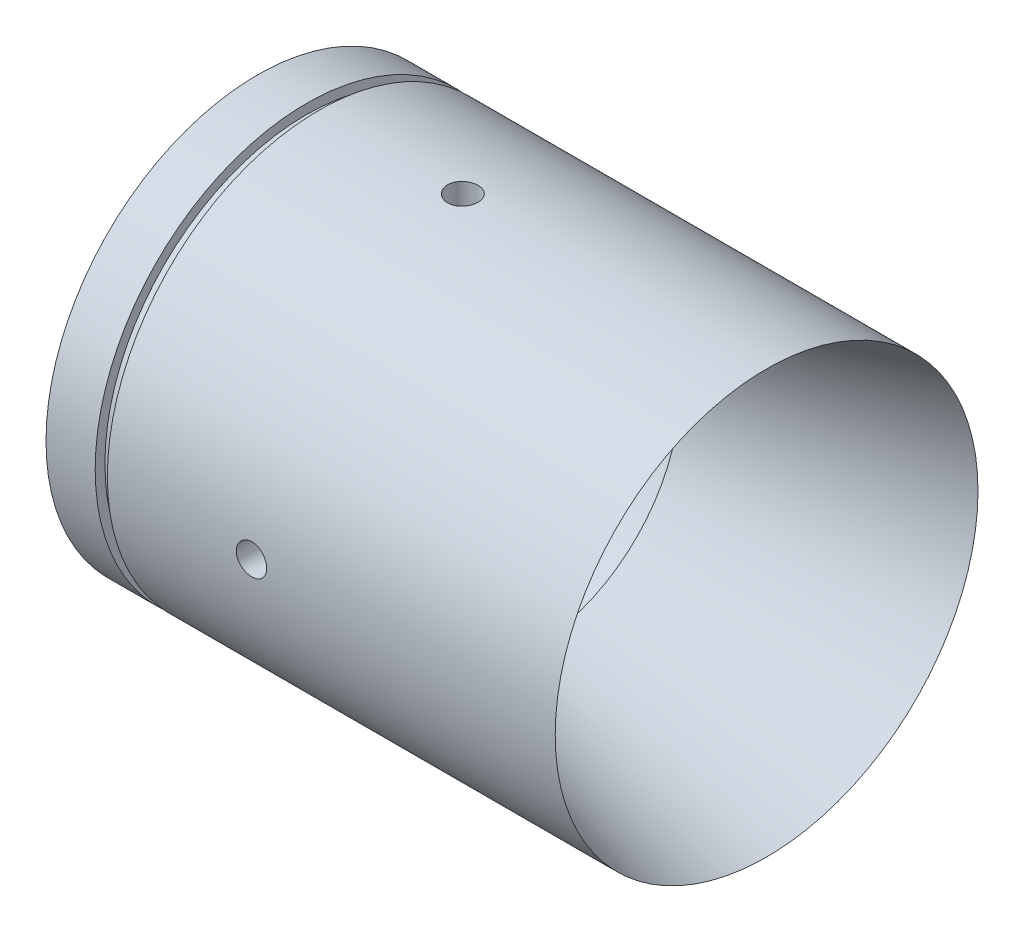
ISO-10303-21;
HEADER;
FILE_DESCRIPTION(('STEP AP214'),'2;1');
FILE_NAME('part.step','',(''),(''),'','','');
FILE_SCHEMA(('AUTOMOTIVE_DESIGN { 1 0 10303 214 1 1 1 1 }'));
ENDSEC;
DATA;
#1=APPLICATION_CONTEXT('core data for automotive mechanical design processes');
#2=APPLICATION_PROTOCOL_DEFINITION('international standard','automotive_design',2000,#1);
#3=PRODUCT_CONTEXT('',#1,'mechanical');
#4=PRODUCT('Part','Part','',(#3));
#5=PRODUCT_RELATED_PRODUCT_CATEGORY('part','',(#4));
#6=PRODUCT_DEFINITION_FORMATION('','',#4);
#7=PRODUCT_DEFINITION_CONTEXT('part definition',#1,'design');
#8=PRODUCT_DEFINITION('design','',#6,#7);
#9=PRODUCT_DEFINITION_SHAPE('','',#8);
#10=(LENGTH_UNIT() NAMED_UNIT(*) SI_UNIT(.MILLI.,.METRE.));
#11=(NAMED_UNIT(*) PLANE_ANGLE_UNIT() SI_UNIT($,.RADIAN.));
#12=(NAMED_UNIT(*) SI_UNIT($,.STERADIAN.) SOLID_ANGLE_UNIT());
#13=UNCERTAINTY_MEASURE_WITH_UNIT(LENGTH_MEASURE(1.E-05),#10,'distance_accuracy_value','');
#14=(GEOMETRIC_REPRESENTATION_CONTEXT(3) GLOBAL_UNCERTAINTY_ASSIGNED_CONTEXT((#13)) GLOBAL_UNIT_ASSIGNED_CONTEXT((#10,
#11,#12)) REPRESENTATION_CONTEXT('',''));
#15=CARTESIAN_POINT('',(0.,0.,0.));
#16=DIRECTION('',(0.,0.,1.));
#17=DIRECTION('',(1.,0.,0.));
#18=AXIS2_PLACEMENT_3D('',#15,#16,#17);
#19=CARTESIAN_POINT('',(56.7357994700031,0.,0.));
#20=DIRECTION('',(1.,0.,0.));
#21=DIRECTION('',(0.,0.,-1.));
#22=AXIS2_PLACEMENT_3D('',#19,#20,#21);
#23=CONICAL_SURFACE('',#22,24.42663247495,0.26179938779915);
#24=CARTESIAN_POINT('',(95.4422700174594,0.,0.));
#25=DIRECTION('',(-1.,0.,0.));
#26=DIRECTION('',(0.,0.,1.));
#27=AXIS2_PLACEMENT_3D('',#24,#25,#26);
#28=CIRCLE('',#27,34.798);
#29=CARTESIAN_POINT('',(95.4422700174594,0.,34.798));
#30=VERTEX_POINT('',#29);
#31=EDGE_CURVE('E112',#30,#30,#28,.T.);
#32=ORIENTED_EDGE('',*,*,#31,.F.);
#33=EDGE_LOOP('',(#32));
#34=FACE_BOUND('',#33,.T.);
#35=CARTESIAN_POINT('',(56.7357994700031,0.,0.));
#36=DIRECTION('',(-1.,0.,0.));
#37=DIRECTION('',(0.,0.,1.));
#38=AXIS2_PLACEMENT_3D('',#35,#36,#37);
#39=CIRCLE('',#38,24.42663247495);
#40=CARTESIAN_POINT('',(56.7357994700031,0.,24.42663247495));
#41=VERTEX_POINT('',#40);
#42=EDGE_CURVE('E148',#41,#41,#39,.T.);
#43=ORIENTED_EDGE('',*,*,#42,.T.);
#44=EDGE_LOOP('',(#43));
#45=FACE_BOUND('',#44,.T.);
#46=ADVANCED_FACE('F45',(#34,#45),#23,.F.);
#47=CARTESIAN_POINT('',(0.,0.,0.));
#48=DIRECTION('',(-1.,0.,0.));
#49=DIRECTION('',(0.,0.,1.));
#50=AXIS2_PLACEMENT_3D('',#47,#48,#49);
#51=CYLINDRICAL_SURFACE('',#50,34.798);
#52=CARTESIAN_POINT('',(47.9422700174594,0.,34.798));
#53=CARTESIAN_POINT('',(47.9422638651147,-0.140232070224378,34.7979988131856));
#54=CARTESIAN_POINT('',(47.9304313322201,-0.280561204962303,34.797143266945));
#55=CARTESIAN_POINT('',(47.8834006635371,-0.55734143785648,34.7938125771131));
#56=CARTESIAN_POINT('',(47.8481756312223,-0.693787883173452,34.7913355692237));
#57=CARTESIAN_POINT('',(47.7553797950332,-0.958753720267815,34.7850420473997));
#58=CARTESIAN_POINT('',(47.6978211334051,-1.08727737554598,34.7812262614336));
#59=CARTESIAN_POINT('',(47.5620124693311,-1.3328065475426,34.7726838356696));
#60=CARTESIAN_POINT('',(47.4837670760282,-1.44981462205071,34.7679573988343));
#61=CARTESIAN_POINT('',(47.308641621064,-1.66924975252944,34.758114355118));
#62=CARTESIAN_POINT('',(47.2117299392095,-1.77165154610397,34.7529970951985));
#63=CARTESIAN_POINT('',(47.0020889353283,-1.95875089976409,34.7429546834242));
#64=CARTESIAN_POINT('',(46.8893589389798,-2.04344770471708,34.7380295397706));
#65=CARTESIAN_POINT('',(46.6511331021634,-2.19281467646115,34.7289215743421));
#66=CARTESIAN_POINT('',(46.525623677119,-2.25746323034525,34.724739555748));
#67=CARTESIAN_POINT('',(46.2654967177605,-2.36476040455502,34.7175981403018));
#68=CARTESIAN_POINT('',(46.1308793073209,-2.40740932402193,34.7146387268253));
#69=CARTESIAN_POINT('',(45.8566062215182,-2.4694248230028,34.7102826247283));
#70=CARTESIAN_POINT('',(45.7169597278509,-2.48883181636928,34.7088832237987));
#71=CARTESIAN_POINT('',(45.4363848217684,-2.50393736845123,34.7077968459207));
#72=CARTESIAN_POINT('',(45.2954564278373,-2.49963626848068,34.7081098443196));
#73=CARTESIAN_POINT('',(45.0165941839541,-2.46748119809726,34.7104104517583));
#74=CARTESIAN_POINT('',(44.8786552532201,-2.43967103645734,34.7123949459666));
#75=CARTESIAN_POINT('',(44.6094083529666,-2.36135526882414,34.7178100259643));
#76=CARTESIAN_POINT('',(44.4781004335723,-2.31084949129847,34.7212406226831));
#77=CARTESIAN_POINT('',(44.225702617916,-2.18852671286023,34.7291649178295));
#78=CARTESIAN_POINT('',(44.1046223415049,-2.11668992905148,34.7336596023302));
#79=CARTESIAN_POINT('',(43.8762220134568,-1.95375862095133,34.7432046376416));
#80=CARTESIAN_POINT('',(43.7689021678489,-1.86266380837176,34.7482549967702));
#81=CARTESIAN_POINT('',(43.5708142995803,-1.66355597700898,34.7583561274119));
#82=CARTESIAN_POINT('',(43.4800843630888,-1.55550506154043,34.7634068738893));
#83=CARTESIAN_POINT('',(43.3180458649676,-1.32568477781079,34.7729286717732));
#84=CARTESIAN_POINT('',(43.2467373123731,-1.20391540316754,34.7773997229099));
#85=CARTESIAN_POINT('',(43.1255686390427,-0.950090997871727,34.7852588837137));
#86=CARTESIAN_POINT('',(43.0757100618037,-0.818035227838129,34.7886469154443));
#87=CARTESIAN_POINT('',(42.9988825867704,-0.547397355857924,34.7939573032981));
#88=CARTESIAN_POINT('',(42.9719133359024,-0.408815354614907,34.7958796820294));
#89=CARTESIAN_POINT('',(42.9416774947304,-0.129389165588208,34.798039247795));
#90=CARTESIAN_POINT('',(42.9383582677413,0.0114492988830646,34.7982801771232));
#91=CARTESIAN_POINT('',(42.9553790153833,0.291680859111885,34.7970596676351));
#92=CARTESIAN_POINT('',(42.9757188266859,0.431073964840654,34.7955982405707));
#93=CARTESIAN_POINT('',(43.0394366769996,0.704308925519821,34.7911398758925));
#94=CARTESIAN_POINT('',(43.0827904635603,0.838156464689569,34.7881445548347));
#95=CARTESIAN_POINT('',(43.1912809221519,1.09667656032768,34.7809551746432));
#96=CARTESIAN_POINT('',(43.2564178520888,1.22134900814435,34.7767611013166));
#97=CARTESIAN_POINT('',(43.4067588848614,1.45822035412203,34.7676356834002));
#98=CARTESIAN_POINT('',(43.4919980254457,1.57039696387806,34.7627030570712));
#99=CARTESIAN_POINT('',(43.6800730146969,1.77886772599583,34.7526595763064));
#100=CARTESIAN_POINT('',(43.7829090910135,1.87516167285355,34.7475487195656));
#101=CARTESIAN_POINT('',(44.0034864581062,2.04931291745418,34.7377138567571));
#102=CARTESIAN_POINT('',(44.12125481241,2.12713598373645,34.7329905794096));
#103=CARTESIAN_POINT('',(44.3682182573191,2.26190197830735,34.724475266893));
#104=CARTESIAN_POINT('',(44.49741325923,2.31884506865003,34.7206832244965));
#105=CARTESIAN_POINT('',(44.7634391779447,2.41017582399965,34.7144633323478));
#106=CARTESIAN_POINT('',(44.9002627506124,2.44458478955716,34.712034194612));
#107=CARTESIAN_POINT('',(45.1777633000552,2.48994002983755,34.7088105196398));
#108=CARTESIAN_POINT('',(45.3184402238526,2.50088662696858,34.708015959942));
#109=CARTESIAN_POINT('',(45.5993139145838,2.49900306410505,34.7081516026741));
#110=CARTESIAN_POINT('',(45.7395110473528,2.48622670469443,34.7090779024209));
#111=CARTESIAN_POINT('',(46.0157635038009,2.43737171538772,34.7125426103964));
#112=CARTESIAN_POINT('',(46.151818820409,2.40129304571167,34.7150810213772));
#113=CARTESIAN_POINT('',(46.4159315948728,2.30687037704918,34.7214829286438));
#114=CARTESIAN_POINT('',(46.5439892535566,2.24852693741249,34.7253463916406));
#115=CARTESIAN_POINT('',(46.7884996749989,2.11123753032451,34.7339630623031));
#116=CARTESIAN_POINT('',(46.9049526891096,2.03229200924097,34.7387162506913));
#117=CARTESIAN_POINT('',(47.1232224615629,1.85583843518412,34.7485894791245));
#118=CARTESIAN_POINT('',(47.2250073062475,1.75829094917522,34.7537102838096));
#119=CARTESIAN_POINT('',(47.4107954546222,1.54746584172785,34.7637349226143));
#120=CARTESIAN_POINT('',(47.4947944221383,1.43418439549179,34.7686387035938));
#121=CARTESIAN_POINT('',(47.6427088921662,1.19494158332964,34.777683360122));
#122=CARTESIAN_POINT('',(47.7065942518245,1.06896155639352,34.7818230868309));
#123=CARTESIAN_POINT('',(47.8122261743158,0.808122707008585,34.7888587470858));
#124=CARTESIAN_POINT('',(47.8539984675038,0.673274409919492,34.7917561254557));
#125=CARTESIAN_POINT('',(47.9034514885049,0.448010871321605,34.7952277277088));
#126=CARTESIAN_POINT('',(47.9179893979847,0.359048810136022,34.7962626633209));
#127=CARTESIAN_POINT('',(47.9374006288326,0.180071174693232,34.797649179902));
#128=CARTESIAN_POINT('',(47.9422739684323,0.0900556024237099,34.7980007621601));
#129=CARTESIAN_POINT('',(47.9422700174594,0.,34.798));
#130=B_SPLINE_CURVE_WITH_KNOTS('',3,(#52,#53,#54,#55,#56,#57,#58,#59,#60,#61,#62,#63,#64,#65,
#66,#67,#68,#69,#70,#71,#72,#73,#74,#75,#76,#77,#78,#79,#80,#81,#82,#83,#84,#85,#86,#87,#88,#89,
#90,#91,#92,#93,#94,#95,#96,#97,#98,#99,#100,#101,#102,#103,#104,#105,#106,#107,#108,#109,#110,
#111,#112,#113,#114,#115,#116,#117,#118,#119,#120,#121,#122,#123,#124,#125,#126,#127,#128,#129),
.UNSPECIFIED.,.T.,.F.,(4,2,2,2,2,2,2,2,2,2,2,2,2,2,2,2,2,2,2,2,2,2,2,2,2,2,2,2,2,2,2,2,2,2,2,2,
2,2,4),(0.,0.420367435957745,0.841219046130305,1.26184216948819,1.68237165404745,
2.10361987099586,2.5248860508695,2.94660480824208,3.36831783111974,3.7892964953813,
4.21026909903196,4.63045895166843,5.05065198013314,5.47123592953415,5.8918261754244,
6.31337018670221,6.73491439409325,7.15648892988496,7.57805696266357,7.99868643846272,
8.41931301049545,8.83949719773544,9.25968636000793,9.68061338811127,10.1015458621161,
10.5232524489597,10.9449557627771,11.366259880799,11.787558209433,12.2079022549593,
12.6282470180673,13.0485812217014,13.468906319068,13.8901325440612,14.3114613455217,
14.7334185900431,15.1548837676812,15.4248399484405,15.6947956199492),.UNSPECIFIED.);
#131=CARTESIAN_POINT('',(47.9422700174594,0.,34.798));
#132=VERTEX_POINT('',#131);
#133=EDGE_CURVE('E10',#132,#132,#130,.T.);
#134=ORIENTED_EDGE('',*,*,#133,.T.);
#135=EDGE_LOOP('',(#134));
#136=FACE_BOUND('',#135,.T.);
#137=CARTESIAN_POINT('',(45.4422700174594,-34.7080798085979,-2.5));
#138=CARTESIAN_POINT('',(45.3020384738666,-34.7080810068695,-2.49999384717913));
#139=CARTESIAN_POINT('',(45.1617098640146,-34.7089388213644,-2.48816140015104));
#140=CARTESIAN_POINT('',(44.8849307217404,-34.7122776153492,-2.44113110355941));
#141=CARTESIAN_POINT('',(44.7484848425689,-34.7147604633841,-2.40590635567266));
#142=CARTESIAN_POINT('',(44.4835202023432,-34.7210666569983,-2.31311135160497));
#143=CARTESIAN_POINT('',(44.3549971729933,-34.7248892732472,-2.25555325122319));
#144=CARTESIAN_POINT('',(44.1094690487968,-34.7334433677983,-2.11974590864952));
#145=CARTESIAN_POINT('',(43.992461396949,-34.7381746436399,-2.04150127421308));
#146=CARTESIAN_POINT('',(43.7730257852098,-34.7480233138569,-1.86637658414449));
#147=CARTESIAN_POINT('',(43.6706232225416,-34.7531413577172,-1.769464738943));
#148=CARTESIAN_POINT('',(43.4835223856656,-34.7631808881759,-1.55982308598758));
#149=CARTESIAN_POINT('',(43.3988248642333,-34.7681023664097,-1.44709260600404));
#150=CARTESIAN_POINT('',(43.2494571463885,-34.7772001205087,-1.20886634941284));
#151=CARTESIAN_POINT('',(43.1848084304245,-34.7813755950842,-1.08335707136271));
#152=CARTESIAN_POINT('',(43.0775109159544,-34.7885039512966,-0.823230431599246));
#153=CARTESIAN_POINT('',(43.034861820255,-34.7914568494492,-0.688613192953277));
#154=CARTESIAN_POINT('',(42.9728459483896,-34.7958028248979,-0.414340616959004));
#155=CARTESIAN_POINT('',(42.9534387445383,-34.7971986103947,-0.27469446431809));
#156=CARTESIAN_POINT('',(42.9383326533466,-34.7982822390335,0.00587977523790211));
#157=CARTESIAN_POINT('',(42.9426334269348,-34.7979701066022,0.146807843790242));
#158=CARTESIAN_POINT('',(42.9747879839886,-34.795675317403,0.425671536224185));
#159=CARTESIAN_POINT('',(43.0025982871295,-34.7936957445512,0.563612202532549));
#160=CARTESIAN_POINT('',(43.0809149406978,-34.7882924018429,0.832862500996205));
#161=CARTESIAN_POINT('',(43.1314214594879,-34.784868621273,0.964172083953449));
#162=CARTESIAN_POINT('',(43.2537457657139,-34.7769569133654,1.21657190292953));
#163=CARTESIAN_POINT('',(43.3255831619298,-34.772468007659,1.33765260374271));
#164=CARTESIAN_POINT('',(43.4885157733275,-34.7629309396088,1.56605352019722));
#165=CARTESIAN_POINT('',(43.5796112771531,-34.7578827688831,1.67337352955215));
#166=CARTESIAN_POINT('',(43.7787195946145,-34.7477815119466,1.87146060428717));
#167=CARTESIAN_POINT('',(43.8867701648871,-34.7427284403985,1.96218972343144));
#168=CARTESIAN_POINT('',(44.1165894682751,-34.7331984445777,2.12422673754438));
#169=CARTESIAN_POINT('',(44.2383582089443,-34.728721520622,2.19553462181889));
#170=CARTESIAN_POINT('',(44.4921824514794,-34.720849603384,2.31670281594293));
#171=CARTESIAN_POINT('',(44.6242387923407,-34.7174546984597,2.36656137434609));
#172=CARTESIAN_POINT('',(44.8948779037368,-34.7121326323322,2.44338863638893));
#173=CARTESIAN_POINT('',(45.0334605725946,-34.7102054482707,2.47035769651155));
#174=CARTESIAN_POINT('',(45.3128870578696,-34.7080404741524,2.50059281959915));
#175=CARTESIAN_POINT('',(45.453725131332,-34.7077989196548,2.5039116998));
#176=CARTESIAN_POINT('',(45.7339558259132,-34.7090226040375,2.48689039818125));
#177=CARTESIAN_POINT('',(45.8733484570027,-34.7104878311362,2.46655037967228));
#178=CARTESIAN_POINT('',(46.1465811292219,-34.714956535011,2.40283259847564));
#179=CARTESIAN_POINT('',(46.2804269030906,-34.7179583785361,2.35947929452338));
#180=CARTESIAN_POINT('',(46.5389436820262,-34.7251606850747,2.25099039326711));
#181=CARTESIAN_POINT('',(46.6636145772487,-34.7293611624356,2.18585453522725));
#182=CARTESIAN_POINT('',(46.9004848874321,-34.738496546132,2.03551506763203));
#183=CARTESIAN_POINT('',(47.0126618408795,-34.7434327390471,1.95027614773267));
#184=CARTESIAN_POINT('',(47.221133399436,-34.7534788933798,1.76220140359811));
#185=CARTESIAN_POINT('',(47.3174278005213,-34.7585888570285,1.65936535334868));
#186=CARTESIAN_POINT('',(47.4915799952406,-34.7684178604793,1.43878778343587));
#187=CARTESIAN_POINT('',(47.5694035532672,-34.7731361639813,1.32101919651177));
#188=CARTESIAN_POINT('',(47.7041704112661,-34.7816396234676,1.07405515822107));
#189=CARTESIAN_POINT('',(47.7611138733622,-34.7854247866972,0.944859795587455));
#190=CARTESIAN_POINT('',(47.8524448815617,-34.791632021419,0.678834130093486));
#191=CARTESIAN_POINT('',(47.8868538891453,-34.7940553895515,0.542011226779835));
#192=CARTESIAN_POINT('',(47.9322094403981,-34.7972711975045,0.264512086475311));
#193=CARTESIAN_POINT('',(47.9431563029204,-34.7980636594892,0.12383590187727));
#194=CARTESIAN_POINT('',(47.9412735009022,-34.7979284212134,-0.15703826951899));
#195=CARTESIAN_POINT('',(47.928497319425,-34.7970045902938,-0.29723661981915));
#196=CARTESIAN_POINT('',(47.8796422570514,-34.7935482775092,-0.57349155497165));
#197=CARTESIAN_POINT('',(47.8435633385462,-34.7910157930481,-0.709548133139154));
#198=CARTESIAN_POINT('',(47.7491397110088,-34.7846266040699,-0.973663388802924));
#199=CARTESIAN_POINT('',(47.6907955566989,-34.7807699325442,-1.10172226546369));
#200=CARTESIAN_POINT('',(47.5535043442819,-34.7721647438501,-1.34623482367745));
#201=CARTESIAN_POINT('',(47.4745577338731,-34.7674162460621,-1.46268875733379));
#202=CARTESIAN_POINT('',(47.2981029765924,-34.7575483238317,-1.68095844060699));
#203=CARTESIAN_POINT('',(47.2005556447649,-34.7524281307232,-1.78274247669278));
#204=CARTESIAN_POINT('',(46.9897311762941,-34.7424002943373,-1.9685290658162));
#205=CARTESIAN_POINT('',(46.8764502130776,-34.7374927031488,-2.05252728058367));
#206=CARTESIAN_POINT('',(46.63720777937,-34.7284376313186,-2.20044095751089));
#207=CARTESIAN_POINT('',(46.5112275615303,-34.7242913007214,-2.26432613707864));
#208=CARTESIAN_POINT('',(46.2503883042428,-34.7172425943412,-2.3699576696832));
#209=CARTESIAN_POINT('',(46.1155397912865,-34.7143387734064,-2.41172975574953));
#210=CARTESIAN_POINT('',(45.8902768087042,-34.7108590426828,-2.46118218196505));
#211=CARTESIAN_POINT('',(45.8013155614706,-34.7098215420987,-2.47571982398573));
#212=CARTESIAN_POINT('',(45.6223395574569,-34.7084315409512,-2.49513069943523));
#213=CARTESIAN_POINT('',(45.5323248026823,-34.7080790390842,-2.50000395125767));
#214=CARTESIAN_POINT('',(45.4422700174594,-34.7080798085979,-2.5));
#215=B_SPLINE_CURVE_WITH_KNOTS('',3,(#137,#138,#139,#140,#141,#142,#143,#144,#145,#146,#147,
#148,#149,#150,#151,#152,#153,#154,#155,#156,#157,#158,#159,#160,#161,#162,#163,#164,#165,#166,
#167,#168,#169,#170,#171,#172,#173,#174,#175,#176,#177,#178,#179,#180,#181,#182,#183,#184,#185,
#186,#187,#188,#189,#190,#191,#192,#193,#194,#195,#196,#197,#198,#199,#200,#201,#202,#203,#204,
#205,#206,#207,#208,#209,#210,#211,#212,#213,#214),.UNSPECIFIED.,.T.,.F.,(4,2,2,2,2,2,2,2,2,2,2,
2,2,2,2,2,2,2,2,2,2,2,2,2,2,2,2,2,2,2,2,2,2,2,2,2,2,2,4),(0.,0.420365854253131,
0.841215917418299,1.26183723709979,1.68236494565742,2.10361523201788,2.52488342527907,
2.94660142159572,3.3683137207683,3.78929140976414,4.21026307795359,4.63045786798768,
5.05065577511833,5.47124115868705,5.89183284651051,6.31337478605378,6.73491695771527,
7.15649354390535,7.57806356430642,7.99869180914788,8.41931715052987,8.83949633978927,
9.25968055874788,9.68060838701995,10.1015416220155,10.5232490658249,10.9449532352133,
11.3662551934788,11.7875514261679,12.207899009091,12.628247270421,13.0485850597598,
13.4689137157772,13.8901378345608,14.3114645791525,14.7334226812292,15.154888664772,
15.4248423984254,15.6947956182925),.UNSPECIFIED.);
#216=CARTESIAN_POINT('',(45.4422700174594,-34.7080798085979,-2.5));
#217=VERTEX_POINT('',#216);
#218=EDGE_CURVE('E56',#217,#217,#215,.T.);
#219=ORIENTED_EDGE('',*,*,#218,.T.);
#220=EDGE_LOOP('',(#219));
#221=FACE_BOUND('',#220,.T.);
#222=CARTESIAN_POINT('',(45.4422700174594,2.50000000000037,-34.7080798085979));
#223=CARTESIAN_POINT('',(45.3020384738666,2.49999384717949,-34.7080810068695));
#224=CARTESIAN_POINT('',(45.1617098640146,2.4881614001514,-34.7089388213644));
#225=CARTESIAN_POINT('',(44.8849307217404,2.44113110355978,-34.7122776153492));
#226=CARTESIAN_POINT('',(44.7484848425689,2.40590635567303,-34.7147604633841));
#227=CARTESIAN_POINT('',(44.4835202023432,2.31311135160533,-34.7210666569982));
#228=CARTESIAN_POINT('',(44.3549971729933,2.25555325122355,-34.7248892732472));
#229=CARTESIAN_POINT('',(44.1094690487968,2.11974590864988,-34.7334433677983));
#230=CARTESIAN_POINT('',(43.992461396949,2.04150127421345,-34.7381746436399));
#231=CARTESIAN_POINT('',(43.7730257852098,1.86637658414485,-34.7480233138569));
#232=CARTESIAN_POINT('',(43.6706232225416,1.76946473894336,-34.7531413577172));
#233=CARTESIAN_POINT('',(43.4835223856656,1.55982308598795,-34.7631808881759));
#234=CARTESIAN_POINT('',(43.3988248642333,1.44709260600441,-34.7681023664097));
#235=CARTESIAN_POINT('',(43.2494571463885,1.20886634941321,-34.7772001205087));
#236=CARTESIAN_POINT('',(43.1848084304245,1.08335707136308,-34.7813755950842));
#237=CARTESIAN_POINT('',(43.0775109159544,0.823230431599611,-34.7885039512966));
#238=CARTESIAN_POINT('',(43.034861820255,0.688613192953642,-34.7914568494492));
#239=CARTESIAN_POINT('',(42.9728459483896,0.414340616959368,-34.7958028248979));
#240=CARTESIAN_POINT('',(42.9534387445383,0.274694464318454,-34.7971986103947));
#241=CARTESIAN_POINT('',(42.9383326533466,-0.00587977523753685,-34.7982822390335));
#242=CARTESIAN_POINT('',(42.9426334269348,-0.146807843789876,-34.7979701066022));
#243=CARTESIAN_POINT('',(42.9747879839886,-0.425671536223818,-34.795675317403));
#244=CARTESIAN_POINT('',(43.0025982871295,-0.563612202532182,-34.7936957445513));
#245=CARTESIAN_POINT('',(43.0809149406978,-0.832862500995839,-34.7882924018429));
#246=CARTESIAN_POINT('',(43.1314214594879,-0.964172083953083,-34.784868621273));
#247=CARTESIAN_POINT('',(43.2537457657139,-1.21657190292917,-34.7769569133654));
#248=CARTESIAN_POINT('',(43.3255831619298,-1.33765260374234,-34.772468007659));
#249=CARTESIAN_POINT('',(43.4885157733275,-1.56605352019685,-34.7629309396088));
#250=CARTESIAN_POINT('',(43.5796112771531,-1.67337352955178,-34.7578827688832));
#251=CARTESIAN_POINT('',(43.7787195946145,-1.8714606042868,-34.7477815119466));
#252=CARTESIAN_POINT('',(43.8867701648871,-1.96218972343108,-34.7427284403986));
#253=CARTESIAN_POINT('',(44.1165894682751,-2.12422673754401,-34.7331984445777));
#254=CARTESIAN_POINT('',(44.2383582089443,-2.19553462181852,-34.7287215206221));
#255=CARTESIAN_POINT('',(44.4921824514794,-2.31670281594257,-34.720849603384));
#256=CARTESIAN_POINT('',(44.6242387923407,-2.36656137434572,-34.7174546984597));
#257=CARTESIAN_POINT('',(44.8948779037368,-2.44338863638856,-34.7121326323323));
#258=CARTESIAN_POINT('',(45.0334605725946,-2.47035769651118,-34.7102054482707));
#259=CARTESIAN_POINT('',(45.3128870578696,-2.50059281959878,-34.7080404741524));
#260=CARTESIAN_POINT('',(45.4537251313321,-2.50391169979963,-34.7077989196549));
#261=CARTESIAN_POINT('',(45.7339558259132,-2.48689039818089,-34.7090226040375));
#262=CARTESIAN_POINT('',(45.8733484570027,-2.46655037967191,-34.7104878311362));
#263=CARTESIAN_POINT('',(46.1465811292219,-2.40283259847527,-34.714956535011));
#264=CARTESIAN_POINT('',(46.2804269030906,-2.35947929452302,-34.7179583785362));
#265=CARTESIAN_POINT('',(46.5389436820262,-2.25099039326674,-34.7251606850747));
#266=CARTESIAN_POINT('',(46.6636145772487,-2.18585453522688,-34.7293611624356));
#267=CARTESIAN_POINT('',(46.9004848874321,-2.03551506763168,-34.738496546132));
#268=CARTESIAN_POINT('',(47.0126618408795,-1.95027614773232,-34.7434327390471));
#269=CARTESIAN_POINT('',(47.221133399436,-1.76220140359775,-34.7534788933798));
#270=CARTESIAN_POINT('',(47.3174278005213,-1.65936535334832,-34.7585888570285));
#271=CARTESIAN_POINT('',(47.4915799952406,-1.43878778343551,-34.7684178604794));
#272=CARTESIAN_POINT('',(47.5694035532672,-1.32101919651141,-34.7731361639813));
#273=CARTESIAN_POINT('',(47.7041704112661,-1.07405515822071,-34.7816396234676));
#274=CARTESIAN_POINT('',(47.7611138733622,-0.944859795587092,-34.7854247866972));
#275=CARTESIAN_POINT('',(47.8524448815617,-0.678834130093122,-34.791632021419));
#276=CARTESIAN_POINT('',(47.8868538891453,-0.54201122677947,-34.7940553895515));
#277=CARTESIAN_POINT('',(47.9322094403981,-0.264512086474946,-34.7972711975045));
#278=CARTESIAN_POINT('',(47.9431563029204,-0.123835901876906,-34.7980636594892));
#279=CARTESIAN_POINT('',(47.9412735009022,0.157038269519355,-34.7979284212134));
#280=CARTESIAN_POINT('',(47.928497319425,0.297236619819515,-34.7970045902938));
#281=CARTESIAN_POINT('',(47.8796422570514,0.573491554972016,-34.7935482775092));
#282=CARTESIAN_POINT('',(47.8435633385462,0.709548133139518,-34.7910157930481));
#283=CARTESIAN_POINT('',(47.7491397110088,0.973663388803291,-34.7846266040699));
#284=CARTESIAN_POINT('',(47.6907955566989,1.10172226546406,-34.7807699325442));
#285=CARTESIAN_POINT('',(47.5535043442819,1.34623482367782,-34.7721647438501));
#286=CARTESIAN_POINT('',(47.4745577338731,1.46268875733416,-34.7674162460621));
#287=CARTESIAN_POINT('',(47.2981029765924,1.68095844060736,-34.7575483238317));
#288=CARTESIAN_POINT('',(47.2005556447649,1.78274247669315,-34.7524281307232));
#289=CARTESIAN_POINT('',(46.9897311762941,1.96852906581656,-34.7424002943373));
#290=CARTESIAN_POINT('',(46.8764502130776,2.05252728058404,-34.7374927031488));
#291=CARTESIAN_POINT('',(46.63720777937,2.20044095751125,-34.7284376313186));
#292=CARTESIAN_POINT('',(46.5112275615303,2.264326137079,-34.7242913007214));
#293=CARTESIAN_POINT('',(46.2503883042428,2.36995766968357,-34.7172425943411));
#294=CARTESIAN_POINT('',(46.1155397912865,2.41172975574989,-34.7143387734063));
#295=CARTESIAN_POINT('',(45.8902768087042,2.46118218196541,-34.7108590426828));
#296=CARTESIAN_POINT('',(45.8013155614706,2.47571982398609,-34.7098215420986));
#297=CARTESIAN_POINT('',(45.6223395574569,2.4951306994356,-34.7084315409512));
#298=CARTESIAN_POINT('',(45.5323248026823,2.50000395125804,-34.7080790390842));
#299=CARTESIAN_POINT('',(45.4422700174594,2.50000000000037,-34.7080798085979));
#300=B_SPLINE_CURVE_WITH_KNOTS('',3,(#222,#223,#224,#225,#226,#227,#228,#229,#230,#231,#232,
#233,#234,#235,#236,#237,#238,#239,#240,#241,#242,#243,#244,#245,#246,#247,#248,#249,#250,#251,
#252,#253,#254,#255,#256,#257,#258,#259,#260,#261,#262,#263,#264,#265,#266,#267,#268,#269,#270,
#271,#272,#273,#274,#275,#276,#277,#278,#279,#280,#281,#282,#283,#284,#285,#286,#287,#288,#289,
#290,#291,#292,#293,#294,#295,#296,#297,#298,#299),.UNSPECIFIED.,.T.,.F.,(4,2,2,2,2,2,2,2,2,2,2,
2,2,2,2,2,2,2,2,2,2,2,2,2,2,2,2,2,2,2,2,2,2,2,2,2,2,2,4),(0.,0.420365854253131,
0.841215917418299,1.26183723709979,1.68236494565742,2.10361523201788,2.52488342527907,
2.94660142159572,3.3683137207683,3.78929140976414,4.21026307795359,4.63045786798767,
5.05065577511833,5.47124115868705,5.89183284651051,6.31337478605377,6.73491695771526,
7.15649354390535,7.57806356430643,7.99869180914789,8.41931715052987,8.83949633978926,
9.25968055874788,9.68060838701995,10.1015416220155,10.5232490658249,10.9449532352133,
11.3662551934788,11.7875514261679,12.207899009091,12.628247270421,13.0485850597598,
13.4689137157772,13.8901378345608,14.3114645791525,14.7334226812292,15.154888664772,
15.4248423984254,15.6947956182925),.UNSPECIFIED.);
#301=CARTESIAN_POINT('',(45.4422700174594,2.50000000000037,-34.7080798085979));
#302=VERTEX_POINT('',#301);
#303=EDGE_CURVE('E61',#302,#302,#300,.T.);
#304=ORIENTED_EDGE('',*,*,#303,.T.);
#305=EDGE_LOOP('',(#304));
#306=FACE_BOUND('',#305,.T.);
#307=CARTESIAN_POINT('',(45.4422700174594,34.7080798085979,2.5));
#308=CARTESIAN_POINT('',(45.3020384738666,34.7080810068695,2.49999384717913));
#309=CARTESIAN_POINT('',(45.1617098640146,34.7089388213644,2.48816140015104));
#310=CARTESIAN_POINT('',(44.8849307217404,34.7122776153492,2.44113110355941));
#311=CARTESIAN_POINT('',(44.7484848425689,34.7147604633841,2.40590635567266));
#312=CARTESIAN_POINT('',(44.4835202023432,34.7210666569983,2.31311135160497));
#313=CARTESIAN_POINT('',(44.3549971729933,34.7248892732472,2.25555325122319));
#314=CARTESIAN_POINT('',(44.1094690487968,34.7334433677983,2.11974590864952));
#315=CARTESIAN_POINT('',(43.992461396949,34.7381746436399,2.04150127421308));
#316=CARTESIAN_POINT('',(43.7730257852098,34.7480233138569,1.86637658414449));
#317=CARTESIAN_POINT('',(43.6706232225416,34.7531413577172,1.769464738943));
#318=CARTESIAN_POINT('',(43.4835223856656,34.7631808881759,1.55982308598758));
#319=CARTESIAN_POINT('',(43.3988248642333,34.7681023664097,1.44709260600404));
#320=CARTESIAN_POINT('',(43.2494571463885,34.7772001205088,1.20886634941284));
#321=CARTESIAN_POINT('',(43.1848084304245,34.7813755950842,1.08335707136271));
#322=CARTESIAN_POINT('',(43.0775109159544,34.7885039512966,0.823230431599246));
#323=CARTESIAN_POINT('',(43.034861820255,34.7914568494492,0.688613192953277));
#324=CARTESIAN_POINT('',(42.9728459483896,34.7958028248979,0.414340616959004));
#325=CARTESIAN_POINT('',(42.9534387445383,34.7971986103947,0.27469446431809));
#326=CARTESIAN_POINT('',(42.9383326533466,34.7982822390335,-0.00587977523790211));
#327=CARTESIAN_POINT('',(42.9426334269348,34.7979701066022,-0.146807843790242));
#328=CARTESIAN_POINT('',(42.9747879839886,34.795675317403,-0.425671536224185));
#329=CARTESIAN_POINT('',(43.0025982871295,34.7936957445513,-0.563612202532549));
#330=CARTESIAN_POINT('',(43.0809149406978,34.7882924018429,-0.832862500996205));
#331=CARTESIAN_POINT('',(43.1314214594879,34.784868621273,-0.964172083953449));
#332=CARTESIAN_POINT('',(43.2537457657139,34.7769569133654,-1.21657190292953));
#333=CARTESIAN_POINT('',(43.3255831619298,34.772468007659,-1.33765260374271));
#334=CARTESIAN_POINT('',(43.4885157733275,34.7629309396088,-1.56605352019722));
#335=CARTESIAN_POINT('',(43.5796112771531,34.7578827688832,-1.67337352955215));
#336=CARTESIAN_POINT('',(43.7787195946145,34.7477815119466,-1.87146060428717));
#337=CARTESIAN_POINT('',(43.8867701648871,34.7427284403986,-1.96218972343144));
#338=CARTESIAN_POINT('',(44.1165894682751,34.7331984445777,-2.12422673754438));
#339=CARTESIAN_POINT('',(44.2383582089443,34.7287215206221,-2.19553462181889));
#340=CARTESIAN_POINT('',(44.4921824514794,34.720849603384,-2.31670281594293));
#341=CARTESIAN_POINT('',(44.6242387923407,34.7174546984597,-2.36656137434609));
#342=CARTESIAN_POINT('',(44.8948779037368,34.7121326323322,-2.44338863638893));
#343=CARTESIAN_POINT('',(45.0334605725946,34.7102054482707,-2.47035769651155));
#344=CARTESIAN_POINT('',(45.3128870578696,34.7080404741524,-2.50059281959915));
#345=CARTESIAN_POINT('',(45.453725131332,34.7077989196549,-2.5039116998));
#346=CARTESIAN_POINT('',(45.7339558259132,34.7090226040375,-2.48689039818125));
#347=CARTESIAN_POINT('',(45.8733484570027,34.7104878311362,-2.46655037967228));
#348=CARTESIAN_POINT('',(46.1465811292219,34.714956535011,-2.40283259847564));
#349=CARTESIAN_POINT('',(46.2804269030906,34.7179583785361,-2.35947929452338));
#350=CARTESIAN_POINT('',(46.5389436820262,34.7251606850747,-2.25099039326711));
#351=CARTESIAN_POINT('',(46.6636145772487,34.7293611624356,-2.18585453522725));
#352=CARTESIAN_POINT('',(46.9004848874321,34.738496546132,-2.03551506763203));
#353=CARTESIAN_POINT('',(47.0126618408795,34.7434327390471,-1.95027614773267));
#354=CARTESIAN_POINT('',(47.221133399436,34.7534788933798,-1.76220140359811));
#355=CARTESIAN_POINT('',(47.3174278005213,34.7585888570285,-1.65936535334868));
#356=CARTESIAN_POINT('',(47.4915799952406,34.7684178604793,-1.43878778343587));
#357=CARTESIAN_POINT('',(47.5694035532672,34.7731361639813,-1.32101919651177));
#358=CARTESIAN_POINT('',(47.7041704112661,34.7816396234676,-1.07405515822107));
#359=CARTESIAN_POINT('',(47.7611138733622,34.7854247866972,-0.944859795587455));
#360=CARTESIAN_POINT('',(47.8524448815617,34.791632021419,-0.678834130093486));
#361=CARTESIAN_POINT('',(47.8868538891453,34.7940553895515,-0.542011226779835));
#362=CARTESIAN_POINT('',(47.9322094403981,34.7972711975045,-0.264512086475311));
#363=CARTESIAN_POINT('',(47.9431563029204,34.7980636594892,-0.12383590187727));
#364=CARTESIAN_POINT('',(47.9412735009022,34.7979284212134,0.15703826951899));
#365=CARTESIAN_POINT('',(47.928497319425,34.7970045902938,0.29723661981915));
#366=CARTESIAN_POINT('',(47.8796422570514,34.7935482775093,0.57349155497165));
#367=CARTESIAN_POINT('',(47.8435633385462,34.7910157930481,0.709548133139154));
#368=CARTESIAN_POINT('',(47.7491397110088,34.7846266040699,0.973663388802924));
#369=CARTESIAN_POINT('',(47.6907955566989,34.7807699325442,1.10172226546369));
#370=CARTESIAN_POINT('',(47.5535043442819,34.7721647438502,1.34623482367745));
#371=CARTESIAN_POINT('',(47.4745577338731,34.7674162460621,1.46268875733379));
#372=CARTESIAN_POINT('',(47.2981029765924,34.7575483238317,1.68095844060699));
#373=CARTESIAN_POINT('',(47.2005556447649,34.7524281307232,1.78274247669278));
#374=CARTESIAN_POINT('',(46.9897311762941,34.7424002943373,1.9685290658162));
#375=CARTESIAN_POINT('',(46.8764502130776,34.7374927031488,2.05252728058367));
#376=CARTESIAN_POINT('',(46.63720777937,34.7284376313186,2.20044095751089));
#377=CARTESIAN_POINT('',(46.5112275615303,34.7242913007215,2.26432613707864));
#378=CARTESIAN_POINT('',(46.2503883042428,34.7172425943412,2.3699576696832));
#379=CARTESIAN_POINT('',(46.1155397912865,34.7143387734064,2.41172975574953));
#380=CARTESIAN_POINT('',(45.8902768087042,34.7108590426828,2.46118218196505));
#381=CARTESIAN_POINT('',(45.8013155614706,34.7098215420987,2.47571982398573));
#382=CARTESIAN_POINT('',(45.6223395574569,34.7084315409512,2.49513069943523));
#383=CARTESIAN_POINT('',(45.5323248026823,34.7080790390842,2.50000395125767));
#384=CARTESIAN_POINT('',(45.4422700174594,34.7080798085979,2.5));
#385=B_SPLINE_CURVE_WITH_KNOTS('',3,(#307,#308,#309,#310,#311,#312,#313,#314,#315,#316,#317,
#318,#319,#320,#321,#322,#323,#324,#325,#326,#327,#328,#329,#330,#331,#332,#333,#334,#335,#336,
#337,#338,#339,#340,#341,#342,#343,#344,#345,#346,#347,#348,#349,#350,#351,#352,#353,#354,#355,
#356,#357,#358,#359,#360,#361,#362,#363,#364,#365,#366,#367,#368,#369,#370,#371,#372,#373,#374,
#375,#376,#377,#378,#379,#380,#381,#382,#383,#384),.UNSPECIFIED.,.T.,.F.,(4,2,2,2,2,2,2,2,2,2,2,
2,2,2,2,2,2,2,2,2,2,2,2,2,2,2,2,2,2,2,2,2,2,2,2,2,2,2,4),(0.,0.420365854253131,
0.841215917418299,1.26183723709979,1.68236494565742,2.10361523201788,2.52488342527907,
2.94660142159572,3.3683137207683,3.78929140976414,4.21026307795359,4.63045786798768,
5.05065577511833,5.47124115868705,5.89183284651051,6.31337478605378,6.73491695771527,
7.15649354390535,7.57806356430642,7.99869180914788,8.41931715052987,8.83949633978927,
9.25968055874788,9.68060838701995,10.1015416220155,10.5232490658249,10.9449532352133,
11.3662551934788,11.7875514261679,12.207899009091,12.628247270421,13.0485850597598,
13.4689137157772,13.8901378345608,14.3114645791525,14.7334226812292,15.154888664772,
15.4248423984254,15.6947956182925),.UNSPECIFIED.);
#386=CARTESIAN_POINT('',(45.4422700174594,34.7080798085979,2.5));
#387=VERTEX_POINT('',#386);
#388=EDGE_CURVE('E66',#387,#387,#385,.T.);
#389=ORIENTED_EDGE('',*,*,#388,.T.);
#390=EDGE_LOOP('',(#389));
#391=FACE_BOUND('',#390,.T.);
#392=CARTESIAN_POINT('',(21.7236854249492,0.,0.));
#393=DIRECTION('',(-1.,0.,0.));
#394=DIRECTION('',(0.,0.,1.));
#395=AXIS2_PLACEMENT_3D('',#392,#393,#394);
#396=CIRCLE('',#395,34.798);
#397=CARTESIAN_POINT('',(21.7236854249492,0.,34.798));
#398=VERTEX_POINT('',#397);
#399=EDGE_CURVE('E116',#398,#398,#396,.T.);
#400=ORIENTED_EDGE('',*,*,#399,.F.);
#401=EDGE_LOOP('',(#400));
#402=FACE_BOUND('',#401,.T.);
#403=ORIENTED_EDGE('',*,*,#31,.T.);
#404=EDGE_LOOP('',(#403));
#405=FACE_BOUND('',#404,.T.);
#406=ADVANCED_FACE('F77',(#136,#221,#306,#391,#402,#405),#51,.T.);
#407=CARTESIAN_POINT('',(21.7236854249492,33.198,0.));
#408=DIRECTION('',(1.,0.,0.));
#409=DIRECTION('',(0.,0.,-1.));
#410=AXIS2_PLACEMENT_3D('',#407,#408,#409);
#411=PLANE('',#410);
#412=CARTESIAN_POINT('',(21.7236854249492,0.,0.));
#413=DIRECTION('',(-1.,0.,0.));
#414=DIRECTION('',(0.,0.,1.));
#415=AXIS2_PLACEMENT_3D('',#412,#413,#414);
#416=CIRCLE('',#415,33.198);
#417=CARTESIAN_POINT('',(21.7236854249492,0.,33.198));
#418=VERTEX_POINT('',#417);
#419=EDGE_CURVE('E120',#418,#418,#416,.T.);
#420=ORIENTED_EDGE('',*,*,#419,.F.);
#421=EDGE_LOOP('',(#420));
#422=FACE_BOUND('',#421,.T.);
#423=ORIENTED_EDGE('',*,*,#399,.T.);
#424=EDGE_LOOP('',(#423));
#425=FACE_BOUND('',#424,.T.);
#426=ADVANCED_FACE('F187',(#422,#425),#411,.F.);
#427=CARTESIAN_POINT('',(0.,0.,0.));
#428=DIRECTION('',(-1.,0.,0.));
#429=DIRECTION('',(0.,0.,1.));
#430=AXIS2_PLACEMENT_3D('',#427,#428,#429);
#431=CYLINDRICAL_SURFACE('',#430,33.198);
#432=CARTESIAN_POINT('',(19.7236854249492,0.,0.));
#433=DIRECTION('',(-1.,0.,0.));
#434=DIRECTION('',(0.,0.,1.));
#435=AXIS2_PLACEMENT_3D('',#432,#433,#434);
#436=CIRCLE('',#435,33.198);
#437=CARTESIAN_POINT('',(19.7236854249492,0.,33.198));
#438=VERTEX_POINT('',#437);
#439=EDGE_CURVE('E124',#438,#438,#436,.T.);
#440=ORIENTED_EDGE('',*,*,#439,.F.);
#441=EDGE_LOOP('',(#440));
#442=FACE_BOUND('',#441,.T.);
#443=ORIENTED_EDGE('',*,*,#419,.T.);
#444=EDGE_LOOP('',(#443));
#445=FACE_BOUND('',#444,.T.);
#446=ADVANCED_FACE('F222',(#442,#445),#431,.T.);
#447=CARTESIAN_POINT('',(19.7236854249492,34.798,0.));
#448=DIRECTION('',(-1.,0.,0.));
#449=DIRECTION('',(0.,0.,1.));
#450=AXIS2_PLACEMENT_3D('',#447,#448,#449);
#451=PLANE('',#450);
#452=CARTESIAN_POINT('',(19.7236854249492,0.,0.));
#453=DIRECTION('',(-1.,0.,0.));
#454=DIRECTION('',(0.,0.,1.));
#455=AXIS2_PLACEMENT_3D('',#452,#453,#454);
#456=CIRCLE('',#455,34.798);
#457=CARTESIAN_POINT('',(19.7236854249492,0.,34.798));
#458=VERTEX_POINT('',#457);
#459=EDGE_CURVE('E128',#458,#458,#456,.T.);
#460=ORIENTED_EDGE('',*,*,#459,.F.);
#461=EDGE_LOOP('',(#460));
#462=FACE_BOUND('',#461,.T.);
#463=ORIENTED_EDGE('',*,*,#439,.T.);
#464=EDGE_LOOP('',(#463));
#465=FACE_BOUND('',#464,.T.);
#466=ADVANCED_FACE('F216',(#462,#465),#451,.F.);
#467=CARTESIAN_POINT('',(0.,0.,0.));
#468=DIRECTION('',(-1.,0.,0.));
#469=DIRECTION('',(0.,0.,1.));
#470=AXIS2_PLACEMENT_3D('',#467,#468,#469);
#471=CYLINDRICAL_SURFACE('',#470,34.798);
#472=CARTESIAN_POINT('',(11.6269295069273,0.,0.));
#473=DIRECTION('',(-1.,0.,0.));
#474=DIRECTION('',(0.,0.,1.));
#475=AXIS2_PLACEMENT_3D('',#472,#473,#474);
#476=CIRCLE('',#475,34.798);
#477=CARTESIAN_POINT('',(11.6269295069273,0.,34.798));
#478=VERTEX_POINT('',#477);
#479=EDGE_CURVE('E132',#478,#478,#476,.T.);
#480=ORIENTED_EDGE('',*,*,#479,.F.);
#481=EDGE_LOOP('',(#480));
#482=FACE_BOUND('',#481,.T.);
#483=ORIENTED_EDGE('',*,*,#459,.T.);
#484=EDGE_LOOP('',(#483));
#485=FACE_BOUND('',#484,.T.);
#486=ADVANCED_FACE('F210',(#482,#485),#471,.T.);
#487=CARTESIAN_POINT('',(11.6269295069273,34.798,0.));
#488=DIRECTION('',(1.,0.,0.));
#489=DIRECTION('',(0.,0.,-1.));
#490=AXIS2_PLACEMENT_3D('',#487,#488,#489);
#491=PLANE('',#490);
#492=CARTESIAN_POINT('',(11.6269295069273,0.,0.));
#493=DIRECTION('',(-1.,0.,0.));
#494=DIRECTION('',(0.,0.,1.));
#495=AXIS2_PLACEMENT_3D('',#492,#493,#494);
#496=CIRCLE('',#495,31.0014709454852);
#497=CARTESIAN_POINT('',(11.6269295069273,0.,31.0014709454852));
#498=VERTEX_POINT('',#497);
#499=EDGE_CURVE('E136',#498,#498,#496,.T.);
#500=ORIENTED_EDGE('',*,*,#499,.F.);
#501=EDGE_LOOP('',(#500));
#502=FACE_BOUND('',#501,.T.);
#503=ORIENTED_EDGE('',*,*,#479,.T.);
#504=EDGE_LOOP('',(#503));
#505=FACE_BOUND('',#504,.T.);
#506=ADVANCED_FACE('F204',(#502,#505),#491,.F.);
#507=CARTESIAN_POINT('',(11.6269295069273,0.,0.));
#508=DIRECTION('',(-1.,0.,0.));
#509=DIRECTION('',(0.,0.,1.));
#510=AXIS2_PLACEMENT_3D('',#507,#508,#509);
#511=CONICAL_SURFACE('',#510,31.0014709454852,0.223242956285071);
#512=CARTESIAN_POINT('',(29.4966103274177,0.,0.));
#513=DIRECTION('',(-1.,0.,0.));
#514=DIRECTION('',(0.,0.,1.));
#515=AXIS2_PLACEMENT_3D('',#512,#513,#514);
#516=CIRCLE('',#515,26.9445704348874);
#517=CARTESIAN_POINT('',(29.4966103274177,0.,26.9445704348874));
#518=VERTEX_POINT('',#517);
#519=EDGE_CURVE('E140',#518,#518,#516,.T.);
#520=ORIENTED_EDGE('',*,*,#519,.F.);
#521=EDGE_LOOP('',(#520));
#522=FACE_BOUND('',#521,.T.);
#523=ORIENTED_EDGE('',*,*,#499,.T.);
#524=EDGE_LOOP('',(#523));
#525=FACE_BOUND('',#524,.T.);
#526=ADVANCED_FACE('F199',(#522,#525),#511,.F.);
#527=CARTESIAN_POINT('',(0.,0.,0.));
#528=DIRECTION('',(-1.,0.,0.));
#529=DIRECTION('',(0.,0.,1.));
#530=AXIS2_PLACEMENT_3D('',#527,#528,#529);
#531=CYLINDRICAL_SURFACE('',#530,26.9445704348874);
#532=CARTESIAN_POINT('',(56.7357994700031,0.,0.));
#533=DIRECTION('',(-1.,0.,0.));
#534=DIRECTION('',(0.,0.,1.));
#535=AXIS2_PLACEMENT_3D('',#532,#533,#534);
#536=CIRCLE('',#535,26.9445704348874);
#537=CARTESIAN_POINT('',(56.7357994700031,0.,26.9445704348874));
#538=VERTEX_POINT('',#537);
#539=EDGE_CURVE('E144',#538,#538,#536,.T.);
#540=ORIENTED_EDGE('',*,*,#539,.F.);
#541=EDGE_LOOP('',(#540));
#542=FACE_BOUND('',#541,.T.);
#543=ORIENTED_EDGE('',*,*,#519,.T.);
#544=EDGE_LOOP('',(#543));
#545=FACE_BOUND('',#544,.T.);
#546=ADVANCED_FACE('F194',(#542,#545),#531,.F.);
#547=CARTESIAN_POINT('',(56.7357994700031,26.9445704348874,0.));
#548=DIRECTION('',(1.,0.,0.));
#549=DIRECTION('',(0.,0.,-1.));
#550=AXIS2_PLACEMENT_3D('',#547,#548,#549);
#551=PLANE('',#550);
#552=ORIENTED_EDGE('',*,*,#42,.F.);
#553=EDGE_LOOP('',(#552));
#554=FACE_BOUND('',#553,.T.);
#555=ORIENTED_EDGE('',*,*,#539,.T.);
#556=EDGE_LOOP('',(#555));
#557=FACE_BOUND('',#556,.T.);
#558=ADVANCED_FACE('F103',(#554,#557),#551,.F.);
#559=CARTESIAN_POINT('',(45.4422700174594,29.798,0.));
#560=DIRECTION('',(0.,1.,0.));
#561=DIRECTION('',(0.,0.,1.));
#562=AXIS2_PLACEMENT_3D('',#559,#560,#561);
#563=CYLINDRICAL_SURFACE('',#562,2.5);
#564=CARTESIAN_POINT('',(45.4422700174594,29.798,0.));
#565=DIRECTION('',(0.,1.,0.));
#566=DIRECTION('',(0.,0.,1.));
#567=AXIS2_PLACEMENT_3D('',#564,#565,#566);
#568=CIRCLE('',#567,2.5);
#569=CARTESIAN_POINT('',(45.4422700174594,29.798,2.5));
#570=VERTEX_POINT('',#569);
#571=EDGE_CURVE('E152',#570,#570,#568,.T.);
#572=ORIENTED_EDGE('',*,*,#571,.F.);
#573=EDGE_LOOP('',(#572));
#574=FACE_BOUND('',#573,.T.);
#575=ORIENTED_EDGE('',*,*,#388,.F.);
#576=EDGE_LOOP('',(#575));
#577=FACE_BOUND('',#576,.T.);
#578=ADVANCED_FACE('F98',(#574,#577),#563,.F.);
#579=CARTESIAN_POINT('',(45.4422700174594,29.798,0.));
#580=DIRECTION('',(0.,1.,0.));
#581=DIRECTION('',(0.,0.,1.));
#582=AXIS2_PLACEMENT_3D('',#579,#580,#581);
#583=PLANE('',#582);
#584=ORIENTED_EDGE('',*,*,#571,.T.);
#585=EDGE_LOOP('',(#584));
#586=FACE_BOUND('',#585,.T.);
#587=ADVANCED_FACE('F94',(#586),#583,.T.);
#588=CARTESIAN_POINT('',(45.4422700174594,3.12117482804543E-13,-29.798));
#589=DIRECTION('',(0.,0.,-1.));
#590=DIRECTION('',(0.,1.,0.));
#591=AXIS2_PLACEMENT_3D('',#588,#589,#590);
#592=CYLINDRICAL_SURFACE('',#591,2.5);
#593=CARTESIAN_POINT('',(45.4422700174594,3.12117482804543E-13,-29.798));
#594=DIRECTION('',(0.,0.,-1.));
#595=DIRECTION('',(0.,1.,0.));
#596=AXIS2_PLACEMENT_3D('',#593,#594,#595);
#597=CIRCLE('',#596,2.5);
#598=CARTESIAN_POINT('',(45.4422700174594,2.50000000000031,-29.798));
#599=VERTEX_POINT('',#598);
#600=EDGE_CURVE('E157',#599,#599,#597,.T.);
#601=ORIENTED_EDGE('',*,*,#600,.F.);
#602=EDGE_LOOP('',(#601));
#603=FACE_BOUND('',#602,.T.);
#604=ORIENTED_EDGE('',*,*,#303,.F.);
#605=EDGE_LOOP('',(#604));
#606=FACE_BOUND('',#605,.T.);
#607=ADVANCED_FACE('F89',(#603,#606),#592,.F.);
#608=CARTESIAN_POINT('',(45.4422700174594,3.12117482804543E-13,-29.798));
#609=DIRECTION('',(0.,0.,-1.));
#610=DIRECTION('',(0.,1.,0.));
#611=AXIS2_PLACEMENT_3D('',#608,#609,#610);
#612=PLANE('',#611);
#613=ORIENTED_EDGE('',*,*,#600,.T.);
#614=EDGE_LOOP('',(#613));
#615=FACE_BOUND('',#614,.T.);
#616=ADVANCED_FACE('F86',(#615),#612,.T.);
#617=CARTESIAN_POINT('',(45.4422700174594,-29.798,0.));
#618=DIRECTION('',(0.,-1.,0.));
#619=DIRECTION('',(0.,0.,-1.));
#620=AXIS2_PLACEMENT_3D('',#617,#618,#619);
#621=CYLINDRICAL_SURFACE('',#620,2.5);
#622=CARTESIAN_POINT('',(45.4422700174594,-29.798,0.));
#623=DIRECTION('',(0.,-1.,0.));
#624=DIRECTION('',(0.,0.,-1.));
#625=AXIS2_PLACEMENT_3D('',#622,#623,#624);
#626=CIRCLE('',#625,2.5);
#627=CARTESIAN_POINT('',(45.4422700174594,-29.798,-2.5));
#628=VERTEX_POINT('',#627);
#629=EDGE_CURVE('E161',#628,#628,#626,.T.);
#630=ORIENTED_EDGE('',*,*,#629,.F.);
#631=EDGE_LOOP('',(#630));
#632=FACE_BOUND('',#631,.T.);
#633=ORIENTED_EDGE('',*,*,#218,.F.);
#634=EDGE_LOOP('',(#633));
#635=FACE_BOUND('',#634,.T.);
#636=ADVANCED_FACE('F80',(#632,#635),#621,.F.);
#637=CARTESIAN_POINT('',(45.4422700174594,-29.798,0.));
#638=DIRECTION('',(0.,-1.,0.));
#639=DIRECTION('',(0.,0.,-1.));
#640=AXIS2_PLACEMENT_3D('',#637,#638,#639);
#641=PLANE('',#640);
#642=ORIENTED_EDGE('',*,*,#629,.T.);
#643=EDGE_LOOP('',(#642));
#644=FACE_BOUND('',#643,.T.);
#645=ADVANCED_FACE('F85',(#644),#641,.T.);
#646=CARTESIAN_POINT('',(45.4422700174594,-1.04039160934848E-13,29.798));
#647=DIRECTION('',(0.,0.,1.));
#648=DIRECTION('',(0.,-1.,0.));
#649=AXIS2_PLACEMENT_3D('',#646,#647,#648);
#650=CYLINDRICAL_SURFACE('',#649,2.5);
#651=CARTESIAN_POINT('',(45.4422700174594,-1.04039160934848E-13,29.798));
#652=DIRECTION('',(0.,0.,1.));
#653=DIRECTION('',(0.,-1.,0.));
#654=AXIS2_PLACEMENT_3D('',#651,#652,#653);
#655=CIRCLE('',#654,2.5);
#656=CARTESIAN_POINT('',(45.4422700174594,-2.50000000000011,29.798));
#657=VERTEX_POINT('',#656);
#658=EDGE_CURVE('E156',#657,#657,#655,.T.);
#659=ORIENTED_EDGE('',*,*,#658,.F.);
#660=EDGE_LOOP('',(#659));
#661=FACE_BOUND('',#660,.T.);
#662=ORIENTED_EDGE('',*,*,#133,.F.);
#663=EDGE_LOOP('',(#662));
#664=FACE_BOUND('',#663,.T.);
#665=ADVANCED_FACE('F171',(#661,#664),#650,.F.);
#666=CARTESIAN_POINT('',(45.4422700174594,-1.04039160934848E-13,29.798));
#667=DIRECTION('',(0.,0.,1.));
#668=DIRECTION('',(0.,-1.,0.));
#669=AXIS2_PLACEMENT_3D('',#666,#667,#668);
#670=PLANE('',#669);
#671=ORIENTED_EDGE('',*,*,#658,.T.);
#672=EDGE_LOOP('',(#671));
#673=FACE_BOUND('',#672,.T.);
#674=ADVANCED_FACE('F169',(#673),#670,.T.);
#675=CLOSED_SHELL('',(#46,#406,#426,#446,#466,#486,#506,#526,#546,#558,#578,#587,#607,#616,#636,
#645,#665,#674));
#676=MANIFOLD_SOLID_BREP('B2',#675);
#677=ADVANCED_BREP_SHAPE_REPRESENTATION('',(#18,#676),#14);
#678=SHAPE_DEFINITION_REPRESENTATION(#9,#677);
ENDSEC;
END-ISO-10303-21;
